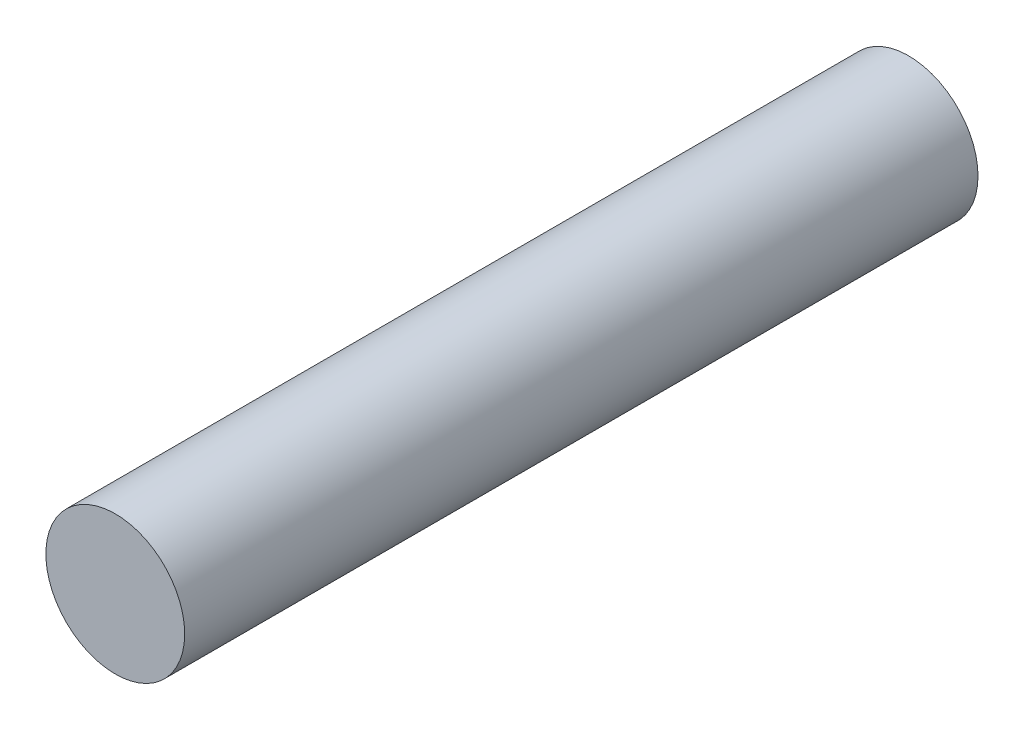
ISO-10303-21;
HEADER;
FILE_DESCRIPTION(('STEP AP214'),'2;1');
FILE_NAME('part.step','',(''),(''),'','','');
FILE_SCHEMA(('AUTOMOTIVE_DESIGN { 1 0 10303 214 1 1 1 1 }'));
ENDSEC;
DATA;
#1=APPLICATION_CONTEXT('core data for automotive mechanical design processes');
#2=APPLICATION_PROTOCOL_DEFINITION('international standard','automotive_design',2000,#1);
#3=PRODUCT_CONTEXT('',#1,'mechanical');
#4=PRODUCT('Part','Part','',(#3));
#5=PRODUCT_RELATED_PRODUCT_CATEGORY('part','',(#4));
#6=PRODUCT_DEFINITION_FORMATION('','',#4);
#7=PRODUCT_DEFINITION_CONTEXT('part definition',#1,'design');
#8=PRODUCT_DEFINITION('design','',#6,#7);
#9=PRODUCT_DEFINITION_SHAPE('','',#8);
#10=(LENGTH_UNIT() NAMED_UNIT(*) SI_UNIT(.MILLI.,.METRE.));
#11=(NAMED_UNIT(*) PLANE_ANGLE_UNIT() SI_UNIT($,.RADIAN.));
#12=(NAMED_UNIT(*) SI_UNIT($,.STERADIAN.) SOLID_ANGLE_UNIT());
#13=UNCERTAINTY_MEASURE_WITH_UNIT(LENGTH_MEASURE(1.E-05),#10,'distance_accuracy_value','');
#14=(GEOMETRIC_REPRESENTATION_CONTEXT(3) GLOBAL_UNCERTAINTY_ASSIGNED_CONTEXT((#13)) GLOBAL_UNIT_ASSIGNED_CONTEXT((#10,
#11,#12)) REPRESENTATION_CONTEXT('',''));
#15=CARTESIAN_POINT('',(0.,0.,0.));
#16=DIRECTION('',(0.,0.,1.));
#17=DIRECTION('',(1.,0.,0.));
#18=AXIS2_PLACEMENT_3D('',#15,#16,#17);
#19=CARTESIAN_POINT('',(0.,0.,20.));
#20=DIRECTION('',(0.,0.,-1.));
#21=DIRECTION('',(-1.,0.,0.));
#22=AXIS2_PLACEMENT_3D('',#19,#20,#21);
#23=CYLINDRICAL_SURFACE('',#22,1.75);
#24=CARTESIAN_POINT('',(0.,0.,20.));
#25=DIRECTION('',(0.,0.,1.));
#26=DIRECTION('',(1.,0.,0.));
#27=AXIS2_PLACEMENT_3D('',#24,#25,#26);
#28=CIRCLE('',#27,1.75);
#29=CARTESIAN_POINT('',(1.75,0.,20.));
#30=VERTEX_POINT('',#29);
#31=EDGE_CURVE('E10',#30,#30,#28,.T.);
#32=ORIENTED_EDGE('',*,*,#31,.F.);
#33=EDGE_LOOP('',(#32));
#34=FACE_BOUND('',#33,.T.);
#35=CARTESIAN_POINT('',(0.,0.,0.));
#36=DIRECTION('',(0.,0.,1.));
#37=DIRECTION('',(1.,0.,0.));
#38=AXIS2_PLACEMENT_3D('',#35,#36,#37);
#39=CIRCLE('',#38,1.75);
#40=CARTESIAN_POINT('',(1.75,0.,0.));
#41=VERTEX_POINT('',#40);
#42=EDGE_CURVE('E35',#41,#41,#39,.T.);
#43=ORIENTED_EDGE('',*,*,#42,.T.);
#44=EDGE_LOOP('',(#43));
#45=FACE_BOUND('',#44,.T.);
#46=ADVANCED_FACE('F32',(#34,#45),#23,.T.);
#47=CARTESIAN_POINT('',(0.,0.,20.));
#48=DIRECTION('',(0.,0.,1.));
#49=DIRECTION('',(1.,0.,0.));
#50=AXIS2_PLACEMENT_3D('',#47,#48,#49);
#51=PLANE('',#50);
#52=ORIENTED_EDGE('',*,*,#31,.T.);
#53=EDGE_LOOP('',(#52));
#54=FACE_BOUND('',#53,.T.);
#55=ADVANCED_FACE('F47',(#54),#51,.T.);
#56=CARTESIAN_POINT('',(0.,0.,0.));
#57=DIRECTION('',(0.,0.,1.));
#58=DIRECTION('',(1.,0.,0.));
#59=AXIS2_PLACEMENT_3D('',#56,#57,#58);
#60=PLANE('',#59);
#61=ORIENTED_EDGE('',*,*,#42,.F.);
#62=EDGE_LOOP('',(#61));
#63=FACE_BOUND('',#62,.T.);
#64=ADVANCED_FACE('F45',(#63),#60,.F.);
#65=CLOSED_SHELL('',(#46,#55,#64));
#66=MANIFOLD_SOLID_BREP('B2',#65);
#67=ADVANCED_BREP_SHAPE_REPRESENTATION('',(#18,#66),#14);
#68=SHAPE_DEFINITION_REPRESENTATION(#9,#67);
ENDSEC;
END-ISO-10303-21;
